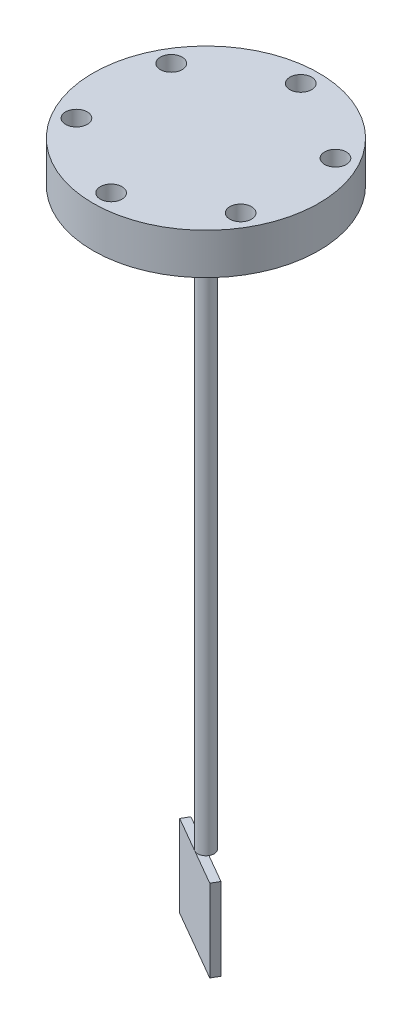
ISO-10303-21;
HEADER;
FILE_DESCRIPTION(('STEP AP214'),'2;1');
FILE_NAME('part.step','',(''),(''),'','','');
FILE_SCHEMA(('AUTOMOTIVE_DESIGN { 1 0 10303 214 1 1 1 1 }'));
ENDSEC;
DATA;
#1=APPLICATION_CONTEXT('core data for automotive mechanical design processes');
#2=APPLICATION_PROTOCOL_DEFINITION('international standard','automotive_design',2000,#1);
#3=PRODUCT_CONTEXT('',#1,'mechanical');
#4=PRODUCT('Part','Part','',(#3));
#5=PRODUCT_RELATED_PRODUCT_CATEGORY('part','',(#4));
#6=PRODUCT_DEFINITION_FORMATION('','',#4);
#7=PRODUCT_DEFINITION_CONTEXT('part definition',#1,'design');
#8=PRODUCT_DEFINITION('design','',#6,#7);
#9=PRODUCT_DEFINITION_SHAPE('','',#8);
#10=(LENGTH_UNIT() NAMED_UNIT(*) SI_UNIT(.MILLI.,.METRE.));
#11=(NAMED_UNIT(*) PLANE_ANGLE_UNIT() SI_UNIT($,.RADIAN.));
#12=(NAMED_UNIT(*) SI_UNIT($,.STERADIAN.) SOLID_ANGLE_UNIT());
#13=UNCERTAINTY_MEASURE_WITH_UNIT(LENGTH_MEASURE(1.E-05),#10,'distance_accuracy_value','');
#14=(GEOMETRIC_REPRESENTATION_CONTEXT(3) GLOBAL_UNCERTAINTY_ASSIGNED_CONTEXT((#13)) GLOBAL_UNIT_ASSIGNED_CONTEXT((#10,
#11,#12)) REPRESENTATION_CONTEXT('',''));
#15=CARTESIAN_POINT('',(0.,0.,0.));
#16=DIRECTION('',(0.,0.,1.));
#17=DIRECTION('',(1.,0.,0.));
#18=AXIS2_PLACEMENT_3D('',#15,#16,#17);
#19=CARTESIAN_POINT('',(0.,-177.8,0.));
#20=DIRECTION('',(0.,-1.,0.));
#21=DIRECTION('',(0.,0.,-1.));
#22=AXIS2_PLACEMENT_3D('',#19,#20,#21);
#23=PLANE('',#22);
#24=CARTESIAN_POINT('',(0.,-177.8,0.));
#25=DIRECTION('',(0.,-1.,0.));
#26=DIRECTION('',(0.,0.,-1.));
#27=AXIS2_PLACEMENT_3D('',#24,#25,#26);
#28=CIRCLE('',#27,2.54);
#29=CARTESIAN_POINT('',(-2.19970452561247,-177.8,-1.27));
#30=VERTEX_POINT('',#29);
#31=CARTESIAN_POINT('',(2.19970452561247,-177.8,1.27));
#32=VERTEX_POINT('',#31);
#33=EDGE_CURVE('E101',#30,#32,#28,.T.);
#34=ORIENTED_EDGE('',*,*,#33,.T.);
#35=DIRECTION('',(-0.866025403784438,0.,-0.5));
#36=VECTOR('',#35,1.);
#37=CARTESIAN_POINT('',(0.,-177.8,0.));
#38=LINE('',#37,#36);
#39=EDGE_CURVE('E11',#32,#30,#38,.T.);
#40=ORIENTED_EDGE('',*,*,#39,.T.);
#41=EDGE_LOOP('',(#34,#40));
#42=FACE_BOUND('',#41,.T.);
#43=ADVANCED_FACE('F30',(#42),#23,.T.);
#44=CARTESIAN_POINT('',(0.,0.,0.));
#45=DIRECTION('',(0.,1.,0.));
#46=DIRECTION('',(0.,0.,1.));
#47=AXIS2_PLACEMENT_3D('',#44,#45,#46);
#48=PLANE('',#47);
#49=CARTESIAN_POINT('',(25.4065872708239,0.,-14.6685000000003));
#50=DIRECTION('',(0.,1.,0.));
#51=DIRECTION('',(-0.866025403784433,0.,0.50000000000001));
#52=AXIS2_PLACEMENT_3D('',#49,#50,#51);
#53=CIRCLE('',#52,3.3655);
#54=CARTESIAN_POINT('',(22.4919787743874,0.,-12.9857500000003));
#55=VERTEX_POINT('',#54);
#56=EDGE_CURVE('E123',#55,#55,#53,.T.);
#57=ORIENTED_EDGE('',*,*,#56,.T.);
#58=EDGE_LOOP('',(#57));
#59=FACE_BOUND('',#58,.T.);
#60=CARTESIAN_POINT('',(2.04859294729732E-13,0.,29.337));
#61=DIRECTION('',(0.,1.,0.));
#62=DIRECTION('',(0.,0.,-1.));
#63=AXIS2_PLACEMENT_3D('',#60,#61,#62);
#64=CIRCLE('',#63,3.3655);
#65=CARTESIAN_POINT('',(1.81358120226105E-13,0.,25.9715));
#66=VERTEX_POINT('',#65);
#67=EDGE_CURVE('E134',#66,#66,#64,.T.);
#68=ORIENTED_EDGE('',*,*,#67,.T.);
#69=EDGE_LOOP('',(#68));
#70=FACE_BOUND('',#69,.T.);
#71=CARTESIAN_POINT('',(-25.4065872708241,0.,-14.6684999999999));
#72=DIRECTION('',(0.,1.,0.));
#73=DIRECTION('',(0.86602540378444,0.,0.499999999999998));
#74=AXIS2_PLACEMENT_3D('',#71,#72,#73);
#75=CIRCLE('',#74,3.3655);
#76=CARTESIAN_POINT('',(-22.4919787743876,0.,-12.9857499999999));
#77=VERTEX_POINT('',#76);
#78=EDGE_CURVE('E146',#77,#77,#75,.T.);
#79=ORIENTED_EDGE('',*,*,#78,.T.);
#80=EDGE_LOOP('',(#79));
#81=FACE_BOUND('',#80,.T.);
#82=CARTESIAN_POINT('',(0.,0.,0.));
#83=DIRECTION('',(0.,1.,0.));
#84=DIRECTION('',(0.,0.,1.));
#85=AXIS2_PLACEMENT_3D('',#82,#83,#84);
#86=CIRCLE('',#85,34.925);
#87=CARTESIAN_POINT('',(0.,0.,34.925));
#88=VERTEX_POINT('',#87);
#89=EDGE_CURVE('E158',#88,#88,#86,.T.);
#90=ORIENTED_EDGE('',*,*,#89,.F.);
#91=EDGE_LOOP('',(#90));
#92=FACE_BOUND('',#91,.T.);
#93=CARTESIAN_POINT('',(0.,0.,-29.337));
#94=DIRECTION('',(0.,1.,0.));
#95=DIRECTION('',(0.,0.,1.));
#96=AXIS2_PLACEMENT_3D('',#93,#94,#95);
#97=CIRCLE('',#96,3.3655);
#98=CARTESIAN_POINT('',(0.,0.,-25.9715));
#99=VERTEX_POINT('',#98);
#100=EDGE_CURVE('E152',#99,#99,#97,.T.);
#101=ORIENTED_EDGE('',*,*,#100,.T.);
#102=EDGE_LOOP('',(#101));
#103=FACE_BOUND('',#102,.T.);
#104=CARTESIAN_POINT('',(-25.406587270824,0.,14.6685000000001));
#105=DIRECTION('',(0.,1.,0.));
#106=DIRECTION('',(0.866025403784436,0.,-0.500000000000004));
#107=AXIS2_PLACEMENT_3D('',#104,#105,#106);
#108=CIRCLE('',#107,3.3655);
#109=CARTESIAN_POINT('',(-22.4919787743875,0.,12.9857500000001));
#110=VERTEX_POINT('',#109);
#111=EDGE_CURVE('E140',#110,#110,#108,.T.);
#112=ORIENTED_EDGE('',*,*,#111,.T.);
#113=EDGE_LOOP('',(#112));
#114=FACE_BOUND('',#113,.T.);
#115=CARTESIAN_POINT('',(25.4065872708242,0.,14.6684999999998));
#116=DIRECTION('',(0.,1.,0.));
#117=DIRECTION('',(-0.866025403784443,0.,-0.499999999999992));
#118=AXIS2_PLACEMENT_3D('',#115,#116,#117);
#119=CIRCLE('',#118,3.3655);
#120=CARTESIAN_POINT('',(22.4919787743877,0.,12.9857499999998));
#121=VERTEX_POINT('',#120);
#122=EDGE_CURVE('E128',#121,#121,#119,.T.);
#123=ORIENTED_EDGE('',*,*,#122,.T.);
#124=EDGE_LOOP('',(#123));
#125=FACE_BOUND('',#124,.T.);
#126=CARTESIAN_POINT('',(0.,0.,0.));
#127=DIRECTION('',(0.,1.,0.));
#128=DIRECTION('',(0.,0.,1.));
#129=AXIS2_PLACEMENT_3D('',#126,#127,#128);
#130=CIRCLE('',#129,2.54);
#131=CARTESIAN_POINT('',(0.,0.,2.54));
#132=VERTEX_POINT('',#131);
#133=EDGE_CURVE('E34',#132,#132,#130,.F.);
#134=ORIENTED_EDGE('',*,*,#133,.F.);
#135=EDGE_LOOP('',(#134));
#136=FACE_BOUND('',#135,.T.);
#137=ADVANCED_FACE('F167',(#59,#70,#81,#92,#103,#114,#125,#136),#48,.F.);
#138=CARTESIAN_POINT('',(0.,12.7,0.));
#139=DIRECTION('',(0.,1.,0.));
#140=DIRECTION('',(0.,0.,1.));
#141=AXIS2_PLACEMENT_3D('',#138,#139,#140);
#142=PLANE('',#141);
#143=CARTESIAN_POINT('',(25.4065872708242,12.7,14.6684999999998));
#144=DIRECTION('',(0.,1.,0.));
#145=DIRECTION('',(-0.866025403784443,0.,-0.499999999999992));
#146=AXIS2_PLACEMENT_3D('',#143,#144,#145);
#147=CIRCLE('',#146,3.3655);
#148=CARTESIAN_POINT('',(22.4919787743877,12.7,12.9857499999998));
#149=VERTEX_POINT('',#148);
#150=EDGE_CURVE('E131',#149,#149,#147,.T.);
#151=ORIENTED_EDGE('',*,*,#150,.F.);
#152=EDGE_LOOP('',(#151));
#153=FACE_BOUND('',#152,.T.);
#154=CARTESIAN_POINT('',(-25.406587270824,12.7,14.6685000000001));
#155=DIRECTION('',(0.,1.,0.));
#156=DIRECTION('',(0.866025403784436,0.,-0.500000000000004));
#157=AXIS2_PLACEMENT_3D('',#154,#155,#156);
#158=CIRCLE('',#157,3.3655);
#159=CARTESIAN_POINT('',(-22.4919787743875,12.7,12.9857500000001));
#160=VERTEX_POINT('',#159);
#161=EDGE_CURVE('E143',#160,#160,#158,.T.);
#162=ORIENTED_EDGE('',*,*,#161,.F.);
#163=EDGE_LOOP('',(#162));
#164=FACE_BOUND('',#163,.T.);
#165=CARTESIAN_POINT('',(0.,12.7,-29.337));
#166=DIRECTION('',(0.,1.,0.));
#167=DIRECTION('',(0.,0.,1.));
#168=AXIS2_PLACEMENT_3D('',#165,#166,#167);
#169=CIRCLE('',#168,3.3655);
#170=CARTESIAN_POINT('',(0.,12.7,-25.9715));
#171=VERTEX_POINT('',#170);
#172=EDGE_CURVE('E155',#171,#171,#169,.T.);
#173=ORIENTED_EDGE('',*,*,#172,.F.);
#174=EDGE_LOOP('',(#173));
#175=FACE_BOUND('',#174,.T.);
#176=CARTESIAN_POINT('',(0.,12.7,0.));
#177=DIRECTION('',(0.,1.,0.));
#178=DIRECTION('',(0.,0.,1.));
#179=AXIS2_PLACEMENT_3D('',#176,#177,#178);
#180=CIRCLE('',#179,34.925);
#181=CARTESIAN_POINT('',(0.,12.7,34.925));
#182=VERTEX_POINT('',#181);
#183=EDGE_CURVE('E161',#182,#182,#180,.T.);
#184=ORIENTED_EDGE('',*,*,#183,.T.);
#185=EDGE_LOOP('',(#184));
#186=FACE_BOUND('',#185,.T.);
#187=CARTESIAN_POINT('',(-25.4065872708241,12.7,-14.6684999999999));
#188=DIRECTION('',(0.,1.,0.));
#189=DIRECTION('',(0.86602540378444,0.,0.499999999999998));
#190=AXIS2_PLACEMENT_3D('',#187,#188,#189);
#191=CIRCLE('',#190,3.3655);
#192=CARTESIAN_POINT('',(-22.4919787743876,12.7,-12.9857499999999));
#193=VERTEX_POINT('',#192);
#194=EDGE_CURVE('E149',#193,#193,#191,.T.);
#195=ORIENTED_EDGE('',*,*,#194,.F.);
#196=EDGE_LOOP('',(#195));
#197=FACE_BOUND('',#196,.T.);
#198=CARTESIAN_POINT('',(2.04859294729732E-13,12.7,29.337));
#199=DIRECTION('',(0.,1.,0.));
#200=DIRECTION('',(0.,0.,-1.));
#201=AXIS2_PLACEMENT_3D('',#198,#199,#200);
#202=CIRCLE('',#201,3.3655);
#203=CARTESIAN_POINT('',(1.81358120226105E-13,12.7,25.9715));
#204=VERTEX_POINT('',#203);
#205=EDGE_CURVE('E137',#204,#204,#202,.T.);
#206=ORIENTED_EDGE('',*,*,#205,.F.);
#207=EDGE_LOOP('',(#206));
#208=FACE_BOUND('',#207,.T.);
#209=CARTESIAN_POINT('',(25.4065872708239,12.7,-14.6685000000003));
#210=DIRECTION('',(0.,1.,0.));
#211=DIRECTION('',(-0.866025403784433,0.,0.50000000000001));
#212=AXIS2_PLACEMENT_3D('',#209,#210,#211);
#213=CIRCLE('',#212,3.3655);
#214=CARTESIAN_POINT('',(22.4919787743874,12.7,-12.9857500000003));
#215=VERTEX_POINT('',#214);
#216=EDGE_CURVE('E125',#215,#215,#213,.T.);
#217=ORIENTED_EDGE('',*,*,#216,.F.);
#218=EDGE_LOOP('',(#217));
#219=FACE_BOUND('',#218,.T.);
#220=ADVANCED_FACE('F170',(#153,#164,#175,#186,#197,#208,#219),#142,.T.);
#221=CARTESIAN_POINT('',(0.,12.7,0.));
#222=DIRECTION('',(0.,-1.,0.));
#223=DIRECTION('',(0.,0.,-1.));
#224=AXIS2_PLACEMENT_3D('',#221,#222,#223);
#225=CYLINDRICAL_SURFACE('',#224,34.925);
#226=ORIENTED_EDGE('',*,*,#183,.F.);
#227=EDGE_LOOP('',(#226));
#228=FACE_BOUND('',#227,.T.);
#229=ORIENTED_EDGE('',*,*,#89,.T.);
#230=EDGE_LOOP('',(#229));
#231=FACE_BOUND('',#230,.T.);
#232=ADVANCED_FACE('F32',(#228,#231),#225,.T.);
#233=CARTESIAN_POINT('',(0.,12.7,-29.337));
#234=DIRECTION('',(0.,-1.,0.));
#235=DIRECTION('',(0.,0.,-1.));
#236=AXIS2_PLACEMENT_3D('',#233,#234,#235);
#237=CYLINDRICAL_SURFACE('',#236,3.3655);
#238=ORIENTED_EDGE('',*,*,#172,.T.);
#239=EDGE_LOOP('',(#238));
#240=FACE_BOUND('',#239,.T.);
#241=ORIENTED_EDGE('',*,*,#100,.F.);
#242=EDGE_LOOP('',(#241));
#243=FACE_BOUND('',#242,.T.);
#244=ADVANCED_FACE('F305',(#240,#243),#237,.F.);
#245=CARTESIAN_POINT('',(-25.4065872708241,12.7,-14.6684999999999));
#246=DIRECTION('',(0.,-1.,0.));
#247=DIRECTION('',(0.,0.,-1.));
#248=AXIS2_PLACEMENT_3D('',#245,#246,#247);
#249=CYLINDRICAL_SURFACE('',#248,3.3655);
#250=ORIENTED_EDGE('',*,*,#194,.T.);
#251=EDGE_LOOP('',(#250));
#252=FACE_BOUND('',#251,.T.);
#253=ORIENTED_EDGE('',*,*,#78,.F.);
#254=EDGE_LOOP('',(#253));
#255=FACE_BOUND('',#254,.T.);
#256=ADVANCED_FACE('F295',(#252,#255),#249,.F.);
#257=CARTESIAN_POINT('',(-25.406587270824,12.7,14.6685000000001));
#258=DIRECTION('',(0.,-1.,0.));
#259=DIRECTION('',(0.,0.,-1.));
#260=AXIS2_PLACEMENT_3D('',#257,#258,#259);
#261=CYLINDRICAL_SURFACE('',#260,3.3655);
#262=ORIENTED_EDGE('',*,*,#161,.T.);
#263=EDGE_LOOP('',(#262));
#264=FACE_BOUND('',#263,.T.);
#265=ORIENTED_EDGE('',*,*,#111,.F.);
#266=EDGE_LOOP('',(#265));
#267=FACE_BOUND('',#266,.T.);
#268=ADVANCED_FACE('F285',(#264,#267),#261,.F.);
#269=CARTESIAN_POINT('',(2.04859294729732E-13,12.7,29.337));
#270=DIRECTION('',(0.,-1.,0.));
#271=DIRECTION('',(0.,0.,-1.));
#272=AXIS2_PLACEMENT_3D('',#269,#270,#271);
#273=CYLINDRICAL_SURFACE('',#272,3.3655);
#274=ORIENTED_EDGE('',*,*,#205,.T.);
#275=EDGE_LOOP('',(#274));
#276=FACE_BOUND('',#275,.T.);
#277=ORIENTED_EDGE('',*,*,#67,.F.);
#278=EDGE_LOOP('',(#277));
#279=FACE_BOUND('',#278,.T.);
#280=ADVANCED_FACE('F275',(#276,#279),#273,.F.);
#281=CARTESIAN_POINT('',(25.4065872708242,12.7,14.6684999999998));
#282=DIRECTION('',(0.,-1.,0.));
#283=DIRECTION('',(0.,0.,-1.));
#284=AXIS2_PLACEMENT_3D('',#281,#282,#283);
#285=CYLINDRICAL_SURFACE('',#284,3.3655);
#286=ORIENTED_EDGE('',*,*,#150,.T.);
#287=EDGE_LOOP('',(#286));
#288=FACE_BOUND('',#287,.T.);
#289=ORIENTED_EDGE('',*,*,#122,.F.);
#290=EDGE_LOOP('',(#289));
#291=FACE_BOUND('',#290,.T.);
#292=ADVANCED_FACE('F194',(#288,#291),#285,.F.);
#293=CARTESIAN_POINT('',(25.4065872708239,12.7,-14.6685000000003));
#294=DIRECTION('',(0.,-1.,0.));
#295=DIRECTION('',(0.,0.,-1.));
#296=AXIS2_PLACEMENT_3D('',#293,#294,#295);
#297=CYLINDRICAL_SURFACE('',#296,3.3655);
#298=ORIENTED_EDGE('',*,*,#216,.T.);
#299=EDGE_LOOP('',(#298));
#300=FACE_BOUND('',#299,.T.);
#301=ORIENTED_EDGE('',*,*,#56,.F.);
#302=EDGE_LOOP('',(#301));
#303=FACE_BOUND('',#302,.T.);
#304=ADVANCED_FACE('F184',(#300,#303),#297,.F.);
#305=CARTESIAN_POINT('',(0.,-177.8,0.));
#306=DIRECTION('',(0.,1.,0.));
#307=DIRECTION('',(0.,0.,1.));
#308=AXIS2_PLACEMENT_3D('',#305,#306,#307);
#309=CYLINDRICAL_SURFACE('',#308,2.54);
#310=CARTESIAN_POINT('',(-1.27,-177.8,2.19970452561247));
#311=VERTEX_POINT('',#310);
#312=EDGE_CURVE('E121',#32,#311,#28,.T.);
#313=ORIENTED_EDGE('',*,*,#312,.F.);
#314=ORIENTED_EDGE('',*,*,#33,.F.);
#315=EDGE_CURVE('E124',#311,#30,#28,.T.);
#316=ORIENTED_EDGE('',*,*,#315,.F.);
#317=EDGE_LOOP('',(#313,#314,#316));
#318=FACE_BOUND('',#317,.T.);
#319=ORIENTED_EDGE('',*,*,#133,.T.);
#320=EDGE_LOOP('',(#319));
#321=FACE_BOUND('',#320,.T.);
#322=ADVANCED_FACE('F181',(#318,#321),#309,.T.);
#323=CARTESIAN_POINT('',(9.72852262806237,-177.8,8.54970452561247));
#324=DIRECTION('',(0.,-1.,0.));
#325=DIRECTION('',(0.,0.,-1.));
#326=AXIS2_PLACEMENT_3D('',#323,#324,#325);
#327=PLANE('',#326);
#328=CARTESIAN_POINT('',(10.9985226280624,-177.8,6.35));
#329=VERTEX_POINT('',#328);
#330=EDGE_CURVE('E40',#329,#32,#38,.T.);
#331=ORIENTED_EDGE('',*,*,#330,.T.);
#332=ORIENTED_EDGE('',*,*,#312,.T.);
#333=DIRECTION('',(-0.866025403784438,0.,-0.5));
#334=VECTOR('',#333,1.);
#335=CARTESIAN_POINT('',(-1.27,-177.8,2.19970452561247));
#336=LINE('',#335,#334);
#337=CARTESIAN_POINT('',(9.72852262806237,-177.8,8.54970452561247));
#338=VERTEX_POINT('',#337);
#339=EDGE_CURVE('E90',#338,#311,#336,.T.);
#340=ORIENTED_EDGE('',*,*,#339,.F.);
#341=DIRECTION('',(0.500000000000001,0.,-0.866025403784438));
#342=VECTOR('',#341,1.);
#343=CARTESIAN_POINT('',(9.72852262806237,-177.8,8.54970452561247));
#344=LINE('',#343,#342);
#345=EDGE_CURVE('E113',#338,#329,#344,.T.);
#346=ORIENTED_EDGE('',*,*,#345,.T.);
#347=EDGE_LOOP('',(#331,#332,#340,#346));
#348=FACE_BOUND('',#347,.T.);
#349=ADVANCED_FACE('F183',(#348),#327,.F.);
#350=CARTESIAN_POINT('',(-12.2685226280624,-177.8,-4.15029547438753));
#351=VERTEX_POINT('',#350);
#352=EDGE_CURVE('E97',#311,#351,#336,.T.);
#353=ORIENTED_EDGE('',*,*,#352,.F.);
#354=ORIENTED_EDGE('',*,*,#315,.T.);
#355=CARTESIAN_POINT('',(-10.9985226280624,-177.8,-6.35));
#356=VERTEX_POINT('',#355);
#357=EDGE_CURVE('E41',#30,#356,#38,.T.);
#358=ORIENTED_EDGE('',*,*,#357,.T.);
#359=DIRECTION('',(-0.500000000000002,0.,0.866025403784437));
#360=VECTOR('',#359,1.);
#361=CARTESIAN_POINT('',(-10.9985226280624,-177.8,-6.35));
#362=LINE('',#361,#360);
#363=EDGE_CURVE('E111',#356,#351,#362,.T.);
#364=ORIENTED_EDGE('',*,*,#363,.T.);
#365=EDGE_LOOP('',(#353,#354,#358,#364));
#366=FACE_BOUND('',#365,.T.);
#367=ADVANCED_FACE('F191',(#366),#327,.F.);
#368=CARTESIAN_POINT('',(-10.9985226280624,-203.2,-6.35));
#369=DIRECTION('',(-0.866025403784437,0.,-0.500000000000002));
#370=DIRECTION('',(-0.500000000000002,0.,0.866025403784437));
#371=AXIS2_PLACEMENT_3D('',#368,#369,#370);
#372=PLANE('',#371);
#373=ORIENTED_EDGE('',*,*,#363,.F.);
#374=DIRECTION('',(0.,1.,0.));
#375=VECTOR('',#374,1.);
#376=CARTESIAN_POINT('',(-10.9985226280624,-203.2,-6.35));
#377=LINE('',#376,#375);
#378=CARTESIAN_POINT('',(-10.9985226280624,-203.2,-6.35));
#379=VERTEX_POINT('',#378);
#380=EDGE_CURVE('E102',#379,#356,#377,.T.);
#381=ORIENTED_EDGE('',*,*,#380,.F.);
#382=DIRECTION('',(-0.500000000000002,0.,0.866025403784437));
#383=VECTOR('',#382,1.);
#384=CARTESIAN_POINT('',(-10.9985226280624,-203.2,-6.35));
#385=LINE('',#384,#383);
#386=CARTESIAN_POINT('',(-12.2685226280624,-203.2,-4.15029547438753));
#387=VERTEX_POINT('',#386);
#388=EDGE_CURVE('E84',#379,#387,#385,.T.);
#389=ORIENTED_EDGE('',*,*,#388,.T.);
#390=DIRECTION('',(0.,1.,0.));
#391=VECTOR('',#390,1.);
#392=CARTESIAN_POINT('',(-12.2685226280624,-203.2,-4.15029547438753));
#393=LINE('',#392,#391);
#394=EDGE_CURVE('E93',#387,#351,#393,.T.);
#395=ORIENTED_EDGE('',*,*,#394,.T.);
#396=EDGE_LOOP('',(#373,#381,#389,#395));
#397=FACE_BOUND('',#396,.T.);
#398=ADVANCED_FACE('F104',(#397),#372,.T.);
#399=CARTESIAN_POINT('',(0.,-203.2,0.));
#400=DIRECTION('',(0.5,0.,-0.866025403784438));
#401=DIRECTION('',(-0.866025403784439,0.,-0.5));
#402=AXIS2_PLACEMENT_3D('',#399,#400,#401);
#403=PLANE('',#402);
#404=ORIENTED_EDGE('',*,*,#330,.F.);
#405=DIRECTION('',(0.,1.,0.));
#406=VECTOR('',#405,1.);
#407=CARTESIAN_POINT('',(10.9985226280624,-203.2,6.35));
#408=LINE('',#407,#406);
#409=CARTESIAN_POINT('',(10.9985226280624,-203.2,6.35));
#410=VERTEX_POINT('',#409);
#411=EDGE_CURVE('E118',#410,#329,#408,.T.);
#412=ORIENTED_EDGE('',*,*,#411,.F.);
#413=DIRECTION('',(-0.866025403784439,0.,-0.5));
#414=VECTOR('',#413,1.);
#415=CARTESIAN_POINT('',(0.,-203.2,0.));
#416=LINE('',#415,#414);
#417=EDGE_CURVE('E105',#410,#379,#416,.T.);
#418=ORIENTED_EDGE('',*,*,#417,.T.);
#419=ORIENTED_EDGE('',*,*,#380,.T.);
#420=ORIENTED_EDGE('',*,*,#357,.F.);
#421=ORIENTED_EDGE('',*,*,#39,.F.);
#422=EDGE_LOOP('',(#404,#412,#418,#419,#420,#421));
#423=FACE_BOUND('',#422,.T.);
#424=ADVANCED_FACE('F207',(#423),#403,.T.);
#425=CARTESIAN_POINT('',(9.72852262806237,-203.2,8.54970452561247));
#426=DIRECTION('',(0.866025403784438,0.,0.500000000000001));
#427=DIRECTION('',(0.500000000000001,0.,-0.866025403784438));
#428=AXIS2_PLACEMENT_3D('',#425,#426,#427);
#429=PLANE('',#428);
#430=ORIENTED_EDGE('',*,*,#345,.F.);
#431=DIRECTION('',(0.,1.,0.));
#432=VECTOR('',#431,1.);
#433=CARTESIAN_POINT('',(9.72852262806237,-203.2,8.54970452561247));
#434=LINE('',#433,#432);
#435=CARTESIAN_POINT('',(9.72852262806237,-203.2,8.54970452561247));
#436=VERTEX_POINT('',#435);
#437=EDGE_CURVE('E110',#436,#338,#434,.T.);
#438=ORIENTED_EDGE('',*,*,#437,.F.);
#439=DIRECTION('',(0.500000000000001,0.,-0.866025403784438));
#440=VECTOR('',#439,1.);
#441=CARTESIAN_POINT('',(9.72852262806237,-203.2,8.54970452561247));
#442=LINE('',#441,#440);
#443=EDGE_CURVE('E87',#436,#410,#442,.T.);
#444=ORIENTED_EDGE('',*,*,#443,.T.);
#445=ORIENTED_EDGE('',*,*,#411,.T.);
#446=EDGE_LOOP('',(#430,#438,#444,#445));
#447=FACE_BOUND('',#446,.T.);
#448=ADVANCED_FACE('F210',(#447),#429,.T.);
#449=CARTESIAN_POINT('',(-1.27,-203.2,2.19970452561247));
#450=DIRECTION('',(0.5,0.,-0.866025403784438));
#451=DIRECTION('',(-0.866025403784439,0.,-0.5));
#452=AXIS2_PLACEMENT_3D('',#449,#450,#451);
#453=PLANE('',#452);
#454=ORIENTED_EDGE('',*,*,#339,.T.);
#455=ORIENTED_EDGE('',*,*,#352,.T.);
#456=ORIENTED_EDGE('',*,*,#394,.F.);
#457=DIRECTION('',(-0.866025403784439,0.,-0.5));
#458=VECTOR('',#457,1.);
#459=CARTESIAN_POINT('',(-1.27,-203.2,2.19970452561247));
#460=LINE('',#459,#458);
#461=EDGE_CURVE('E80',#436,#387,#460,.T.);
#462=ORIENTED_EDGE('',*,*,#461,.F.);
#463=ORIENTED_EDGE('',*,*,#437,.T.);
#464=EDGE_LOOP('',(#454,#455,#456,#462,#463));
#465=FACE_BOUND('',#464,.T.);
#466=ADVANCED_FACE('F95',(#465),#453,.F.);
#467=CARTESIAN_POINT('',(9.72852262806237,-203.2,8.54970452561247));
#468=DIRECTION('',(0.,-1.,0.));
#469=DIRECTION('',(0.,0.,-1.));
#470=AXIS2_PLACEMENT_3D('',#467,#468,#469);
#471=PLANE('',#470);
#472=ORIENTED_EDGE('',*,*,#461,.T.);
#473=ORIENTED_EDGE('',*,*,#388,.F.);
#474=ORIENTED_EDGE('',*,*,#417,.F.);
#475=ORIENTED_EDGE('',*,*,#443,.F.);
#476=EDGE_LOOP('',(#472,#473,#474,#475));
#477=FACE_BOUND('',#476,.T.);
#478=ADVANCED_FACE('F82',(#477),#471,.T.);
#479=CLOSED_SHELL('',(#43,#137,#220,#232,#244,#256,#268,#280,#292,#304,#322,#349,#367,#398,#424,
#448,#466,#478));
#480=MANIFOLD_SOLID_BREP('B2',#479);
#481=ADVANCED_BREP_SHAPE_REPRESENTATION('',(#18,#480),#14);
#482=SHAPE_DEFINITION_REPRESENTATION(#9,#481);
ENDSEC;
END-ISO-10303-21;
